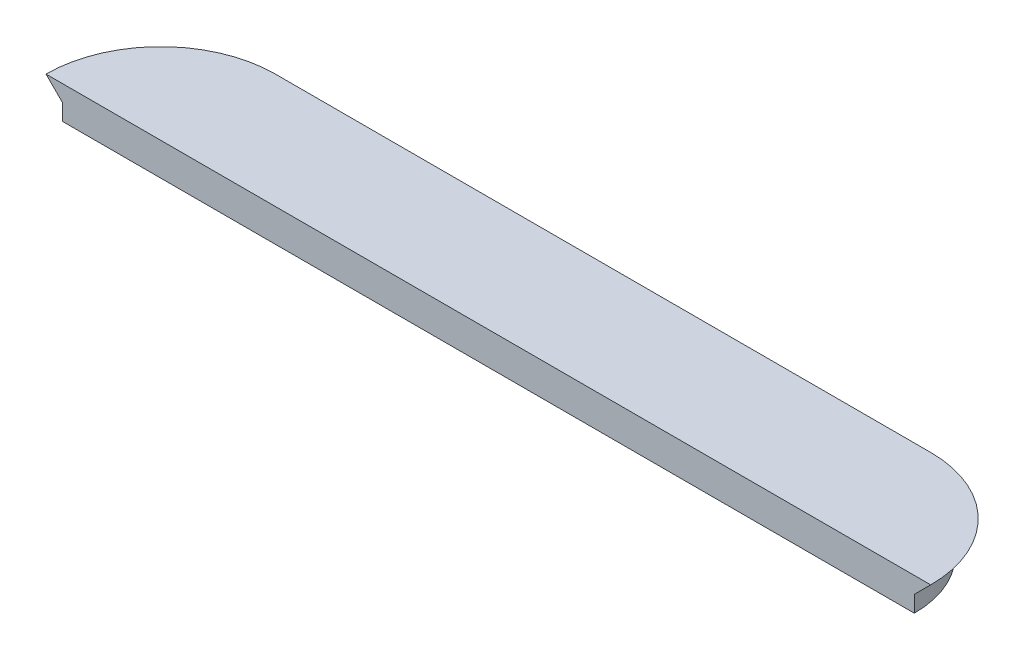
ISO-10303-21;
HEADER;
FILE_DESCRIPTION(('STEP AP214'),'2;1');
FILE_NAME('part.step','',(''),(''),'','','');
FILE_SCHEMA(('AUTOMOTIVE_DESIGN { 1 0 10303 214 1 1 1 1 }'));
ENDSEC;
DATA;
#1=APPLICATION_CONTEXT('core data for automotive mechanical design processes');
#2=APPLICATION_PROTOCOL_DEFINITION('international standard','automotive_design',2000,#1);
#3=PRODUCT_CONTEXT('',#1,'mechanical');
#4=PRODUCT('Part','Part','',(#3));
#5=PRODUCT_RELATED_PRODUCT_CATEGORY('part','',(#4));
#6=PRODUCT_DEFINITION_FORMATION('','',#4);
#7=PRODUCT_DEFINITION_CONTEXT('part definition',#1,'design');
#8=PRODUCT_DEFINITION('design','',#6,#7);
#9=PRODUCT_DEFINITION_SHAPE('','',#8);
#10=(LENGTH_UNIT() NAMED_UNIT(*) SI_UNIT(.MILLI.,.METRE.));
#11=(NAMED_UNIT(*) PLANE_ANGLE_UNIT() SI_UNIT($,.RADIAN.));
#12=(NAMED_UNIT(*) SI_UNIT($,.STERADIAN.) SOLID_ANGLE_UNIT());
#13=UNCERTAINTY_MEASURE_WITH_UNIT(LENGTH_MEASURE(1.E-05),#10,'distance_accuracy_value','');
#14=(GEOMETRIC_REPRESENTATION_CONTEXT(3) GLOBAL_UNCERTAINTY_ASSIGNED_CONTEXT((#13)) GLOBAL_UNIT_ASSIGNED_CONTEXT((#10,
#11,#12)) REPRESENTATION_CONTEXT('',''));
#15=CARTESIAN_POINT('',(0.,0.,0.));
#16=DIRECTION('',(0.,0.,1.));
#17=DIRECTION('',(1.,0.,0.));
#18=AXIS2_PLACEMENT_3D('',#15,#16,#17);
#19=CARTESIAN_POINT('',(0.,2.5,0.));
#20=DIRECTION('',(0.,0.,-1.));
#21=DIRECTION('',(-1.,0.,0.));
#22=AXIS2_PLACEMENT_3D('',#19,#20,#21);
#23=PLANE('',#22);
#24=DIRECTION('',(0.,-1.,0.));
#25=VECTOR('',#24,1.);
#26=CARTESIAN_POINT('',(57.5,1.25,0.));
#27=LINE('',#26,#25);
#28=CARTESIAN_POINT('',(57.5,1.25,0.));
#29=VERTEX_POINT('',#28);
#30=CARTESIAN_POINT('',(57.5,0.,0.));
#31=VERTEX_POINT('',#30);
#32=EDGE_CURVE('E130',#29,#31,#27,.T.);
#33=ORIENTED_EDGE('',*,*,#32,.F.);
#34=DIRECTION('',(-0.707106781186547,-0.707106781186548,0.));
#35=VECTOR('',#34,1.);
#36=CARTESIAN_POINT('',(50.,-6.25,0.));
#37=LINE('',#36,#35);
#38=CARTESIAN_POINT('',(58.75,2.5,0.));
#39=VERTEX_POINT('',#38);
#40=EDGE_CURVE('E11',#29,#39,#37,.F.);
#41=ORIENTED_EDGE('',*,*,#40,.T.);
#42=DIRECTION('',(1.,0.,0.));
#43=VECTOR('',#42,1.);
#44=CARTESIAN_POINT('',(0.,2.5,0.));
#45=LINE('',#44,#43);
#46=CARTESIAN_POINT('',(-8.75,2.5,0.));
#47=VERTEX_POINT('',#46);
#48=EDGE_CURVE('E64',#47,#39,#45,.T.);
#49=ORIENTED_EDGE('',*,*,#48,.F.);
#50=DIRECTION('',(-0.707106781186547,0.707106781186548,0.));
#51=VECTOR('',#50,1.);
#52=CARTESIAN_POINT('',(0.,-6.25,0.));
#53=LINE('',#52,#51);
#54=CARTESIAN_POINT('',(-7.5,1.25,0.));
#55=VERTEX_POINT('',#54);
#56=EDGE_CURVE('E49',#47,#55,#53,.F.);
#57=ORIENTED_EDGE('',*,*,#56,.T.);
#58=DIRECTION('',(0.,-1.,0.));
#59=VECTOR('',#58,1.);
#60=CARTESIAN_POINT('',(-7.5,1.25,0.));
#61=LINE('',#60,#59);
#62=CARTESIAN_POINT('',(-7.5,0.,0.));
#63=VERTEX_POINT('',#62);
#64=EDGE_CURVE('E133',#55,#63,#61,.T.);
#65=ORIENTED_EDGE('',*,*,#64,.T.);
#66=DIRECTION('',(1.,0.,0.));
#67=VECTOR('',#66,1.);
#68=CARTESIAN_POINT('',(0.,0.,0.));
#69=LINE('',#68,#67);
#70=EDGE_CURVE('E132',#63,#31,#69,.T.);
#71=ORIENTED_EDGE('',*,*,#70,.T.);
#72=EDGE_LOOP('',(#33,#41,#49,#57,#65,#71));
#73=FACE_BOUND('',#72,.T.);
#74=ADVANCED_FACE('F39',(#73),#23,.F.);
#75=CARTESIAN_POINT('',(50.,0.,0.));
#76=DIRECTION('',(0.,-1.,0.));
#77=DIRECTION('',(0.,0.,-1.));
#78=AXIS2_PLACEMENT_3D('',#75,#76,#77);
#79=PLANE('',#78);
#80=DIRECTION('',(1.,0.,0.));
#81=VECTOR('',#80,1.);
#82=CARTESIAN_POINT('',(0.,0.,-7.5));
#83=LINE('',#82,#81);
#84=CARTESIAN_POINT('',(0.,0.,-7.5));
#85=VERTEX_POINT('',#84);
#86=CARTESIAN_POINT('',(50.0000000000001,0.,-7.5));
#87=VERTEX_POINT('',#86);
#88=EDGE_CURVE('E124',#85,#87,#83,.T.);
#89=ORIENTED_EDGE('',*,*,#88,.T.);
#90=CARTESIAN_POINT('',(50.,0.,0.));
#91=DIRECTION('',(0.,-1.,0.));
#92=DIRECTION('',(0.,0.,-1.));
#93=AXIS2_PLACEMENT_3D('',#90,#91,#92);
#94=CIRCLE('',#93,7.49999999999998);
#95=EDGE_CURVE('E57',#87,#31,#94,.T.);
#96=ORIENTED_EDGE('',*,*,#95,.T.);
#97=ORIENTED_EDGE('',*,*,#70,.F.);
#98=CARTESIAN_POINT('',(0.,0.,0.));
#99=DIRECTION('',(0.,-1.,0.));
#100=DIRECTION('',(0.,0.,-1.));
#101=AXIS2_PLACEMENT_3D('',#98,#99,#100);
#102=CIRCLE('',#101,7.50000000000002);
#103=EDGE_CURVE('E121',#63,#85,#102,.T.);
#104=ORIENTED_EDGE('',*,*,#103,.T.);
#105=EDGE_LOOP('',(#89,#96,#97,#104));
#106=FACE_BOUND('',#105,.T.);
#107=ADVANCED_FACE('F156',(#106),#79,.T.);
#108=CARTESIAN_POINT('',(50.,2.5,0.));
#109=DIRECTION('',(0.,-1.,0.));
#110=DIRECTION('',(0.,0.,-1.));
#111=AXIS2_PLACEMENT_3D('',#108,#109,#110);
#112=PLANE('',#111);
#113=ORIENTED_EDGE('',*,*,#48,.T.);
#114=CARTESIAN_POINT('',(50.,2.5,0.));
#115=DIRECTION('',(0.,1.,0.));
#116=DIRECTION('',(0.,0.,-1.));
#117=AXIS2_PLACEMENT_3D('',#114,#115,#116);
#118=CIRCLE('',#117,8.75);
#119=CARTESIAN_POINT('',(50.,2.5,-8.75));
#120=VERTEX_POINT('',#119);
#121=EDGE_CURVE('E138',#39,#120,#118,.T.);
#122=ORIENTED_EDGE('',*,*,#121,.T.);
#123=DIRECTION('',(-1.,0.,0.));
#124=VECTOR('',#123,1.);
#125=CARTESIAN_POINT('',(0.,2.5,-8.75));
#126=LINE('',#125,#124);
#127=CARTESIAN_POINT('',(0.,2.5,-8.75));
#128=VERTEX_POINT('',#127);
#129=EDGE_CURVE('E117',#120,#128,#126,.T.);
#130=ORIENTED_EDGE('',*,*,#129,.T.);
#131=CARTESIAN_POINT('',(0.,2.5,0.));
#132=DIRECTION('',(0.,1.,0.));
#133=DIRECTION('',(0.,0.,1.));
#134=AXIS2_PLACEMENT_3D('',#131,#132,#133);
#135=CIRCLE('',#134,8.75);
#136=EDGE_CURVE('E141',#128,#47,#135,.T.);
#137=ORIENTED_EDGE('',*,*,#136,.T.);
#138=EDGE_LOOP('',(#113,#122,#130,#137));
#139=FACE_BOUND('',#138,.T.);
#140=ADVANCED_FACE('F154',(#139),#112,.F.);
#141=CARTESIAN_POINT('',(50.,1.25,0.));
#142=DIRECTION('',(0.,-1.,0.));
#143=DIRECTION('',(0.,0.,-1.));
#144=AXIS2_PLACEMENT_3D('',#141,#142,#143);
#145=CYLINDRICAL_SURFACE('',#144,7.49999999999998);
#146=ORIENTED_EDGE('',*,*,#95,.F.);
#147=DIRECTION('',(0.,-1.,0.));
#148=VECTOR('',#147,1.);
#149=CARTESIAN_POINT('',(50.0000000000001,1.25,-7.5));
#150=LINE('',#149,#148);
#151=CARTESIAN_POINT('',(50.0000000000001,1.25,-7.5));
#152=VERTEX_POINT('',#151);
#153=EDGE_CURVE('E98',#152,#87,#150,.T.);
#154=ORIENTED_EDGE('',*,*,#153,.F.);
#155=CARTESIAN_POINT('',(50.,1.25,0.));
#156=DIRECTION('',(0.,-1.,0.));
#157=DIRECTION('',(0.,0.,-1.));
#158=AXIS2_PLACEMENT_3D('',#155,#156,#157);
#159=CIRCLE('',#158,7.49999999999998);
#160=EDGE_CURVE('E106',#152,#29,#159,.T.);
#161=ORIENTED_EDGE('',*,*,#160,.T.);
#162=ORIENTED_EDGE('',*,*,#32,.T.);
#163=EDGE_LOOP('',(#146,#154,#161,#162));
#164=FACE_BOUND('',#163,.T.);
#165=ADVANCED_FACE('F109',(#164),#145,.T.);
#166=CARTESIAN_POINT('',(0.,1.25,0.));
#167=DIRECTION('',(0.,-1.,0.));
#168=DIRECTION('',(0.,0.,-1.));
#169=AXIS2_PLACEMENT_3D('',#166,#167,#168);
#170=CYLINDRICAL_SURFACE('',#169,7.50000000000002);
#171=ORIENTED_EDGE('',*,*,#103,.F.);
#172=ORIENTED_EDGE('',*,*,#64,.F.);
#173=CARTESIAN_POINT('',(0.,1.25,0.));
#174=DIRECTION('',(0.,-1.,0.));
#175=DIRECTION('',(0.,0.,-1.));
#176=AXIS2_PLACEMENT_3D('',#173,#174,#175);
#177=CIRCLE('',#176,7.50000000000002);
#178=CARTESIAN_POINT('',(0.,1.25,-7.5));
#179=VERTEX_POINT('',#178);
#180=EDGE_CURVE('E105',#55,#179,#177,.T.);
#181=ORIENTED_EDGE('',*,*,#180,.T.);
#182=DIRECTION('',(0.,-1.,0.));
#183=VECTOR('',#182,1.);
#184=CARTESIAN_POINT('',(0.,1.25,-7.5));
#185=LINE('',#184,#183);
#186=EDGE_CURVE('E100',#179,#85,#185,.T.);
#187=ORIENTED_EDGE('',*,*,#186,.T.);
#188=EDGE_LOOP('',(#171,#172,#181,#187));
#189=FACE_BOUND('',#188,.T.);
#190=ADVANCED_FACE('F152',(#189),#170,.T.);
#191=CARTESIAN_POINT('',(0.,1.25,-7.5));
#192=DIRECTION('',(0.,0.,-1.));
#193=DIRECTION('',(-1.,0.,0.));
#194=AXIS2_PLACEMENT_3D('',#191,#192,#193);
#195=PLANE('',#194);
#196=ORIENTED_EDGE('',*,*,#88,.F.);
#197=ORIENTED_EDGE('',*,*,#186,.F.);
#198=DIRECTION('',(1.,0.,0.));
#199=VECTOR('',#198,1.);
#200=CARTESIAN_POINT('',(0.,1.25,-7.5));
#201=LINE('',#200,#199);
#202=EDGE_CURVE('E95',#179,#152,#201,.T.);
#203=ORIENTED_EDGE('',*,*,#202,.T.);
#204=ORIENTED_EDGE('',*,*,#153,.T.);
#205=EDGE_LOOP('',(#196,#197,#203,#204));
#206=FACE_BOUND('',#205,.T.);
#207=ADVANCED_FACE('F97',(#206),#195,.T.);
#208=CARTESIAN_POINT('',(0.,1.25,0.));
#209=DIRECTION('',(0.,1.,0.));
#210=DIRECTION('',(0.,0.,1.));
#211=AXIS2_PLACEMENT_3D('',#208,#209,#210);
#212=CONICAL_SURFACE('',#211,7.49999999999998,0.785398163397447);
#213=ORIENTED_EDGE('',*,*,#56,.F.);
#214=ORIENTED_EDGE('',*,*,#136,.F.);
#215=DIRECTION('',(0.,0.707106781186548,-0.707106781186547));
#216=VECTOR('',#215,1.);
#217=CARTESIAN_POINT('',(0.,1.25,-7.49999999999998));
#218=LINE('',#217,#216);
#219=EDGE_CURVE('E44',#179,#128,#218,.T.);
#220=ORIENTED_EDGE('',*,*,#219,.F.);
#221=ORIENTED_EDGE('',*,*,#180,.F.);
#222=EDGE_LOOP('',(#213,#214,#220,#221));
#223=FACE_BOUND('',#222,.T.);
#224=ADVANCED_FACE('F42',(#223),#212,.T.);
#225=CARTESIAN_POINT('',(0.,1.25,-7.49999999999998));
#226=DIRECTION('',(0.,-0.707106781186547,-0.707106781186548));
#227=DIRECTION('',(-1.,0.,0.));
#228=AXIS2_PLACEMENT_3D('',#225,#226,#227);
#229=PLANE('',#228);
#230=ORIENTED_EDGE('',*,*,#219,.T.);
#231=ORIENTED_EDGE('',*,*,#129,.F.);
#232=DIRECTION('',(0.,0.707106781186548,-0.707106781186547));
#233=VECTOR('',#232,1.);
#234=CARTESIAN_POINT('',(50.,1.25,-7.49999999999998));
#235=LINE('',#234,#233);
#236=EDGE_CURVE('E115',#152,#120,#235,.T.);
#237=ORIENTED_EDGE('',*,*,#236,.F.);
#238=ORIENTED_EDGE('',*,*,#202,.F.);
#239=EDGE_LOOP('',(#230,#231,#237,#238));
#240=FACE_BOUND('',#239,.T.);
#241=ADVANCED_FACE('F116',(#240),#229,.T.);
#242=CARTESIAN_POINT('',(50.,1.25,0.));
#243=DIRECTION('',(0.,1.,0.));
#244=DIRECTION('',(0.,0.,1.));
#245=AXIS2_PLACEMENT_3D('',#242,#243,#244);
#246=CONICAL_SURFACE('',#245,7.49999999999998,0.785398163397447);
#247=ORIENTED_EDGE('',*,*,#236,.T.);
#248=ORIENTED_EDGE('',*,*,#121,.F.);
#249=ORIENTED_EDGE('',*,*,#40,.F.);
#250=ORIENTED_EDGE('',*,*,#160,.F.);
#251=EDGE_LOOP('',(#247,#248,#249,#250));
#252=FACE_BOUND('',#251,.T.);
#253=ADVANCED_FACE('F120',(#252),#246,.T.);
#254=CLOSED_SHELL('',(#74,#107,#140,#165,#190,#207,#224,#241,#253));
#255=MANIFOLD_SOLID_BREP('B2',#254);
#256=ADVANCED_BREP_SHAPE_REPRESENTATION('',(#18,#255),#14);
#257=SHAPE_DEFINITION_REPRESENTATION(#9,#256);
ENDSEC;
END-ISO-10303-21;
